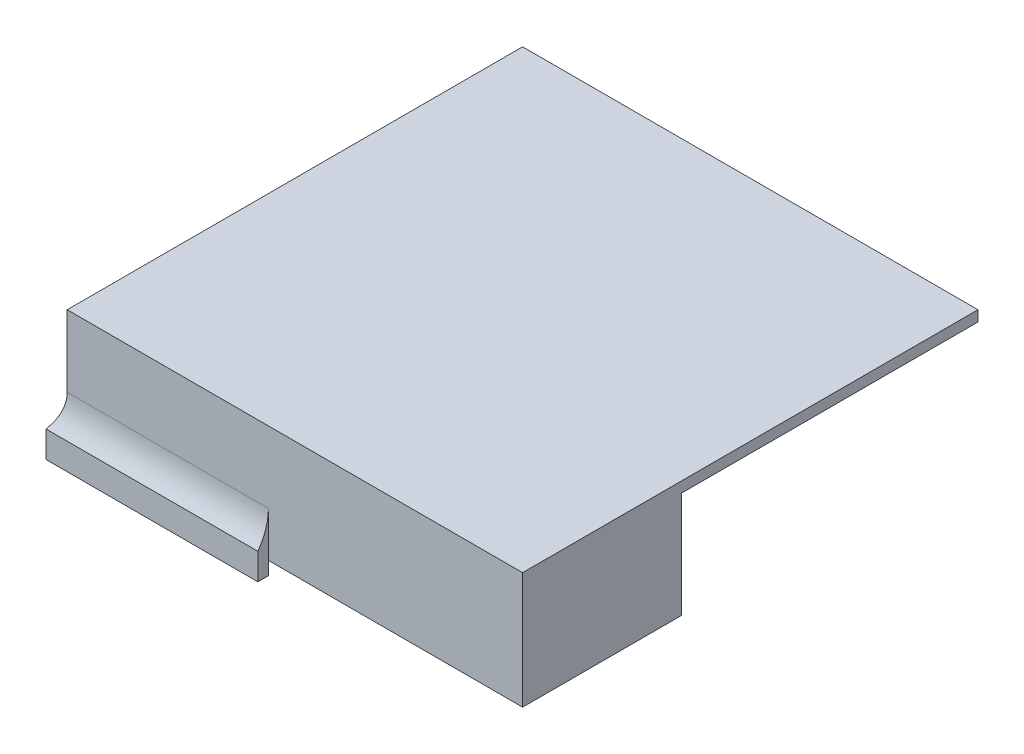
ISO-10303-21;
HEADER;
FILE_DESCRIPTION(('STEP AP214'),'2;1');
FILE_NAME('part.step','',(''),(''),'','','');
FILE_SCHEMA(('AUTOMOTIVE_DESIGN { 1 0 10303 214 1 1 1 1 }'));
ENDSEC;
DATA;
#1=APPLICATION_CONTEXT('core data for automotive mechanical design processes');
#2=APPLICATION_PROTOCOL_DEFINITION('international standard','automotive_design',2000,#1);
#3=PRODUCT_CONTEXT('',#1,'mechanical');
#4=PRODUCT('Part','Part','',(#3));
#5=PRODUCT_RELATED_PRODUCT_CATEGORY('part','',(#4));
#6=PRODUCT_DEFINITION_FORMATION('','',#4);
#7=PRODUCT_DEFINITION_CONTEXT('part definition',#1,'design');
#8=PRODUCT_DEFINITION('design','',#6,#7);
#9=PRODUCT_DEFINITION_SHAPE('','',#8);
#10=(LENGTH_UNIT() NAMED_UNIT(*) SI_UNIT(.MILLI.,.METRE.));
#11=(NAMED_UNIT(*) PLANE_ANGLE_UNIT() SI_UNIT($,.RADIAN.));
#12=(NAMED_UNIT(*) SI_UNIT($,.STERADIAN.) SOLID_ANGLE_UNIT());
#13=UNCERTAINTY_MEASURE_WITH_UNIT(LENGTH_MEASURE(1.E-05),#10,'distance_accuracy_value','');
#14=(GEOMETRIC_REPRESENTATION_CONTEXT(3) GLOBAL_UNCERTAINTY_ASSIGNED_CONTEXT((#13)) GLOBAL_UNIT_ASSIGNED_CONTEXT((#10,
#11,#12)) REPRESENTATION_CONTEXT('',''));
#15=CARTESIAN_POINT('',(0.,0.,0.));
#16=DIRECTION('',(0.,0.,1.));
#17=DIRECTION('',(1.,0.,0.));
#18=AXIS2_PLACEMENT_3D('',#15,#16,#17);
#19=CARTESIAN_POINT('',(0.,20.,43.));
#20=DIRECTION('',(0.,0.,1.));
#21=DIRECTION('',(1.,0.,0.));
#22=AXIS2_PLACEMENT_3D('',#19,#20,#21);
#23=PLANE('',#22);
#24=DIRECTION('',(0.,-1.,0.));
#25=VECTOR('',#24,1.);
#26=CARTESIAN_POINT('',(-43.,20.,43.));
#27=LINE('',#26,#25);
#28=CARTESIAN_POINT('',(-43.,22.,43.));
#29=VERTEX_POINT('',#28);
#30=CARTESIAN_POINT('',(-43.,8.50000000000001,43.));
#31=VERTEX_POINT('',#30);
#32=EDGE_CURVE('E317',#29,#31,#27,.T.);
#33=ORIENTED_EDGE('',*,*,#32,.T.);
#34=DIRECTION('',(1.,0.,0.));
#35=VECTOR('',#34,1.);
#36=CARTESIAN_POINT('',(-4.99999999999999,8.50000000000001,43.));
#37=LINE('',#36,#35);
#38=CARTESIAN_POINT('',(-4.99999999999998,8.50000000000001,43.));
#39=VERTEX_POINT('',#38);
#40=EDGE_CURVE('E329',#31,#39,#37,.T.);
#41=ORIENTED_EDGE('',*,*,#40,.T.);
#42=DIRECTION('',(0.,1.,0.));
#43=VECTOR('',#42,1.);
#44=CARTESIAN_POINT('',(-4.99999999999998,-2.5,43.));
#45=LINE('',#44,#43);
#46=CARTESIAN_POINT('',(-4.99999999999998,0.,43.));
#47=VERTEX_POINT('',#46);
#48=EDGE_CURVE('E60',#47,#39,#45,.T.);
#49=ORIENTED_EDGE('',*,*,#48,.F.);
#50=DIRECTION('',(-1.,0.,0.));
#51=VECTOR('',#50,1.);
#52=CARTESIAN_POINT('',(0.,0.,43.));
#53=LINE('',#52,#51);
#54=CARTESIAN_POINT('',(43.,0.,43.));
#55=VERTEX_POINT('',#54);
#56=EDGE_CURVE('E309',#55,#47,#53,.T.);
#57=ORIENTED_EDGE('',*,*,#56,.F.);
#58=DIRECTION('',(0.,-1.,0.));
#59=VECTOR('',#58,1.);
#60=CARTESIAN_POINT('',(43.,20.,43.));
#61=LINE('',#60,#59);
#62=CARTESIAN_POINT('',(43.,22.,43.));
#63=VERTEX_POINT('',#62);
#64=EDGE_CURVE('E315',#63,#55,#61,.T.);
#65=ORIENTED_EDGE('',*,*,#64,.F.);
#66=DIRECTION('',(1.,0.,0.));
#67=VECTOR('',#66,1.);
#68=CARTESIAN_POINT('',(43.,22.,43.));
#69=LINE('',#68,#67);
#70=EDGE_CURVE('E278',#29,#63,#69,.T.);
#71=ORIENTED_EDGE('',*,*,#70,.F.);
#72=EDGE_LOOP('',(#33,#41,#49,#57,#65,#71));
#73=FACE_BOUND('',#72,.T.);
#74=ADVANCED_FACE('F45',(#73),#23,.T.);
#75=CARTESIAN_POINT('',(14.9827560572969,20.,-14.9827560572969));
#76=DIRECTION('',(0.707106781186547,0.,-0.707106781186548));
#77=DIRECTION('',(-0.707106781186548,0.,-0.707106781186547));
#78=AXIS2_PLACEMENT_3D('',#75,#76,#77);
#79=PLANE('',#78);
#80=DIRECTION('',(0.707106781186548,0.,0.707106781186547));
#81=VECTOR('',#80,1.);
#82=CARTESIAN_POINT('',(14.9827560572969,0.,-14.9827560572969));
#83=LINE('',#82,#81);
#84=CARTESIAN_POINT('',(-13.0344878854062,0.,-43.));
#85=VERTEX_POINT('',#84);
#86=CARTESIAN_POINT('',(43.,0.,13.0344878854062));
#87=VERTEX_POINT('',#86);
#88=EDGE_CURVE('E293',#85,#87,#83,.T.);
#89=ORIENTED_EDGE('',*,*,#88,.F.);
#90=DIRECTION('',(0.,-1.,0.));
#91=VECTOR('',#90,1.);
#92=CARTESIAN_POINT('',(-13.0344878854062,20.,-43.));
#93=LINE('',#92,#91);
#94=CARTESIAN_POINT('',(-13.0344878854062,20.,-43.));
#95=VERTEX_POINT('',#94);
#96=EDGE_CURVE('E324',#95,#85,#93,.T.);
#97=ORIENTED_EDGE('',*,*,#96,.F.);
#98=DIRECTION('',(0.707106781186548,0.,0.707106781186547));
#99=VECTOR('',#98,1.);
#100=CARTESIAN_POINT('',(14.9827560572969,20.,-14.9827560572969));
#101=LINE('',#100,#99);
#102=CARTESIAN_POINT('',(43.,20.,13.0344878854062));
#103=VERTEX_POINT('',#102);
#104=EDGE_CURVE('E294',#95,#103,#101,.T.);
#105=ORIENTED_EDGE('',*,*,#104,.T.);
#106=DIRECTION('',(0.,-1.,0.));
#107=VECTOR('',#106,1.);
#108=CARTESIAN_POINT('',(43.,20.,13.0344878854062));
#109=LINE('',#108,#107);
#110=EDGE_CURVE('E297',#103,#87,#109,.T.);
#111=ORIENTED_EDGE('',*,*,#110,.T.);
#112=EDGE_LOOP('',(#89,#97,#105,#111));
#113=FACE_BOUND('',#112,.T.);
#114=ADVANCED_FACE('F365',(#113),#79,.T.);
#115=CARTESIAN_POINT('',(0.,20.,-43.));
#116=DIRECTION('',(0.,0.,1.));
#117=DIRECTION('',(1.,0.,0.));
#118=AXIS2_PLACEMENT_3D('',#115,#116,#117);
#119=PLANE('',#118);
#120=DIRECTION('',(-1.,0.,0.));
#121=VECTOR('',#120,1.);
#122=CARTESIAN_POINT('',(0.,0.,-43.));
#123=LINE('',#122,#121);
#124=CARTESIAN_POINT('',(-43.,0.,-43.));
#125=VERTEX_POINT('',#124);
#126=EDGE_CURVE('E302',#85,#125,#123,.T.);
#127=ORIENTED_EDGE('',*,*,#126,.T.);
#128=DIRECTION('',(0.,-1.,0.));
#129=VECTOR('',#128,1.);
#130=CARTESIAN_POINT('',(-43.,20.,-43.));
#131=LINE('',#130,#129);
#132=CARTESIAN_POINT('',(-43.,22.,-43.));
#133=VERTEX_POINT('',#132);
#134=EDGE_CURVE('E321',#133,#125,#131,.T.);
#135=ORIENTED_EDGE('',*,*,#134,.F.);
#136=DIRECTION('',(-1.,0.,0.));
#137=VECTOR('',#136,1.);
#138=CARTESIAN_POINT('',(43.,22.,-43.));
#139=LINE('',#138,#137);
#140=CARTESIAN_POINT('',(43.,22.,-43.));
#141=VERTEX_POINT('',#140);
#142=EDGE_CURVE('E284',#141,#133,#139,.T.);
#143=ORIENTED_EDGE('',*,*,#142,.F.);
#144=DIRECTION('',(0.,-1.,0.));
#145=VECTOR('',#144,1.);
#146=CARTESIAN_POINT('',(43.,22.,-43.));
#147=LINE('',#146,#145);
#148=CARTESIAN_POINT('',(43.,20.,-43.));
#149=VERTEX_POINT('',#148);
#150=EDGE_CURVE('E287',#141,#149,#147,.T.);
#151=ORIENTED_EDGE('',*,*,#150,.T.);
#152=DIRECTION('',(-1.,0.,0.));
#153=VECTOR('',#152,1.);
#154=CARTESIAN_POINT('',(43.,20.,-43.));
#155=LINE('',#154,#153);
#156=EDGE_CURVE('E279',#149,#95,#155,.T.);
#157=ORIENTED_EDGE('',*,*,#156,.T.);
#158=ORIENTED_EDGE('',*,*,#96,.T.);
#159=EDGE_LOOP('',(#127,#135,#143,#151,#157,#158));
#160=FACE_BOUND('',#159,.T.);
#161=ADVANCED_FACE('F370',(#160),#119,.F.);
#162=CARTESIAN_POINT('',(-43.,20.,0.));
#163=DIRECTION('',(1.,0.,0.));
#164=DIRECTION('',(0.,0.,-1.));
#165=AXIS2_PLACEMENT_3D('',#162,#163,#164);
#166=PLANE('',#165);
#167=DIRECTION('',(0.,1.,0.));
#168=VECTOR('',#167,1.);
#169=CARTESIAN_POINT('',(-43.,-2.5,3.));
#170=LINE('',#169,#168);
#171=CARTESIAN_POINT('',(-43.,0.,3.));
#172=VERTEX_POINT('',#171);
#173=CARTESIAN_POINT('',(-43.,8.49999999999998,3.));
#174=VERTEX_POINT('',#173);
#175=EDGE_CURVE('E71',#172,#174,#170,.T.);
#176=ORIENTED_EDGE('',*,*,#175,.T.);
#177=DIRECTION('',(0.,0.,1.));
#178=VECTOR('',#177,1.);
#179=CARTESIAN_POINT('',(-43.,8.49999999999998,0.));
#180=LINE('',#179,#178);
#181=EDGE_CURVE('E326',#174,#31,#180,.T.);
#182=ORIENTED_EDGE('',*,*,#181,.T.);
#183=ORIENTED_EDGE('',*,*,#32,.F.);
#184=DIRECTION('',(0.,0.,1.));
#185=VECTOR('',#184,1.);
#186=CARTESIAN_POINT('',(-43.,22.,-43.));
#187=LINE('',#186,#185);
#188=EDGE_CURVE('E274',#133,#29,#187,.T.);
#189=ORIENTED_EDGE('',*,*,#188,.F.);
#190=ORIENTED_EDGE('',*,*,#134,.T.);
#191=DIRECTION('',(0.,0.,1.));
#192=VECTOR('',#191,1.);
#193=CARTESIAN_POINT('',(-43.,0.,0.));
#194=LINE('',#193,#192);
#195=EDGE_CURVE('E305',#125,#172,#194,.T.);
#196=ORIENTED_EDGE('',*,*,#195,.T.);
#197=EDGE_LOOP('',(#176,#182,#183,#189,#190,#196));
#198=FACE_BOUND('',#197,.T.);
#199=ADVANCED_FACE('F339',(#198),#166,.F.);
#200=CARTESIAN_POINT('',(43.,20.,0.));
#201=DIRECTION('',(1.,0.,0.));
#202=DIRECTION('',(0.,0.,-1.));
#203=AXIS2_PLACEMENT_3D('',#200,#201,#202);
#204=PLANE('',#203);
#205=DIRECTION('',(0.,0.,1.));
#206=VECTOR('',#205,1.);
#207=CARTESIAN_POINT('',(43.,0.,0.));
#208=LINE('',#207,#206);
#209=EDGE_CURVE('E298',#87,#55,#208,.T.);
#210=ORIENTED_EDGE('',*,*,#209,.F.);
#211=ORIENTED_EDGE('',*,*,#110,.F.);
#212=DIRECTION('',(0.,0.,-1.));
#213=VECTOR('',#212,1.);
#214=CARTESIAN_POINT('',(43.,20.,-43.));
#215=LINE('',#214,#213);
#216=EDGE_CURVE('E264',#103,#149,#215,.T.);
#217=ORIENTED_EDGE('',*,*,#216,.T.);
#218=ORIENTED_EDGE('',*,*,#150,.F.);
#219=DIRECTION('',(0.,0.,-1.));
#220=VECTOR('',#219,1.);
#221=CARTESIAN_POINT('',(43.,22.,-43.));
#222=LINE('',#221,#220);
#223=EDGE_CURVE('E282',#63,#141,#222,.T.);
#224=ORIENTED_EDGE('',*,*,#223,.F.);
#225=ORIENTED_EDGE('',*,*,#64,.T.);
#226=EDGE_LOOP('',(#210,#211,#217,#218,#224,#225));
#227=FACE_BOUND('',#226,.T.);
#228=ADVANCED_FACE('F375',(#227),#204,.T.);
#229=CARTESIAN_POINT('',(0.,0.,0.));
#230=DIRECTION('',(0.,1.,0.));
#231=DIRECTION('',(0.,0.,1.));
#232=AXIS2_PLACEMENT_3D('',#229,#230,#231);
#233=PLANE('',#232);
#234=DIRECTION('',(0.707106781186548,0.,0.707106781186547));
#235=VECTOR('',#234,1.);
#236=CARTESIAN_POINT('',(-13.8629150101524,0.,-41.));
#237=LINE('',#236,#235);
#238=CARTESIAN_POINT('',(-13.8629150101524,0.,-41.));
#239=VERTEX_POINT('',#238);
#240=CARTESIAN_POINT('',(41.,0.,13.8629150101524));
#241=VERTEX_POINT('',#240);
#242=EDGE_CURVE('E249',#239,#241,#237,.T.);
#243=ORIENTED_EDGE('',*,*,#242,.F.);
#244=DIRECTION('',(1.,0.,0.));
#245=VECTOR('',#244,1.);
#246=CARTESIAN_POINT('',(-41.,0.,-41.));
#247=LINE('',#246,#245);
#248=CARTESIAN_POINT('',(-41.,0.,-41.));
#249=VERTEX_POINT('',#248);
#250=EDGE_CURVE('E197',#249,#239,#247,.T.);
#251=ORIENTED_EDGE('',*,*,#250,.F.);
#252=DIRECTION('',(0.,0.,-1.));
#253=VECTOR('',#252,1.);
#254=CARTESIAN_POINT('',(-41.,0.,41.));
#255=LINE('',#254,#253);
#256=CARTESIAN_POINT('',(-41.,0.,41.));
#257=VERTEX_POINT('',#256);
#258=EDGE_CURVE('E234',#257,#249,#255,.T.);
#259=ORIENTED_EDGE('',*,*,#258,.F.);
#260=DIRECTION('',(-1.,0.,0.));
#261=VECTOR('',#260,1.);
#262=CARTESIAN_POINT('',(41.,0.,41.));
#263=LINE('',#262,#261);
#264=CARTESIAN_POINT('',(41.,0.,41.));
#265=VERTEX_POINT('',#264);
#266=EDGE_CURVE('E256',#265,#257,#263,.T.);
#267=ORIENTED_EDGE('',*,*,#266,.F.);
#268=DIRECTION('',(0.,0.,1.));
#269=VECTOR('',#268,1.);
#270=CARTESIAN_POINT('',(41.,0.,13.8629150101524));
#271=LINE('',#270,#269);
#272=EDGE_CURVE('E253',#241,#265,#271,.T.);
#273=ORIENTED_EDGE('',*,*,#272,.F.);
#274=EDGE_LOOP('',(#243,#251,#259,#267,#273));
#275=FACE_BOUND('',#274,.T.);
#276=ORIENTED_EDGE('',*,*,#88,.T.);
#277=ORIENTED_EDGE('',*,*,#209,.T.);
#278=ORIENTED_EDGE('',*,*,#56,.T.);
#279=CARTESIAN_POINT('',(-43.,0.,43.));
#280=VERTEX_POINT('',#279);
#281=EDGE_CURVE('E308',#47,#280,#53,.T.);
#282=ORIENTED_EDGE('',*,*,#281,.T.);
#283=EDGE_CURVE('E304',#172,#280,#194,.T.);
#284=ORIENTED_EDGE('',*,*,#283,.F.);
#285=ORIENTED_EDGE('',*,*,#195,.F.);
#286=ORIENTED_EDGE('',*,*,#126,.F.);
#287=EDGE_LOOP('',(#276,#277,#278,#282,#284,#285,#286));
#288=FACE_BOUND('',#287,.T.);
#289=ADVANCED_FACE('F467',(#275,#288),#233,.F.);
#290=CARTESIAN_POINT('',(0.,20.,0.));
#291=DIRECTION('',(0.,-1.,0.));
#292=DIRECTION('',(0.,0.,-1.));
#293=AXIS2_PLACEMENT_3D('',#290,#291,#292);
#294=PLANE('',#293);
#295=ORIENTED_EDGE('',*,*,#104,.F.);
#296=ORIENTED_EDGE('',*,*,#156,.F.);
#297=ORIENTED_EDGE('',*,*,#216,.F.);
#298=EDGE_LOOP('',(#295,#296,#297));
#299=FACE_BOUND('',#298,.T.);
#300=ADVANCED_FACE('F472',(#299),#294,.T.);
#301=CARTESIAN_POINT('',(0.,22.,0.));
#302=DIRECTION('',(0.,-1.,0.));
#303=DIRECTION('',(0.,0.,-1.));
#304=AXIS2_PLACEMENT_3D('',#301,#302,#303);
#305=PLANE('',#304);
#306=ORIENTED_EDGE('',*,*,#188,.T.);
#307=ORIENTED_EDGE('',*,*,#70,.T.);
#308=ORIENTED_EDGE('',*,*,#223,.T.);
#309=ORIENTED_EDGE('',*,*,#142,.T.);
#310=EDGE_LOOP('',(#306,#307,#308,#309));
#311=FACE_BOUND('',#310,.T.);
#312=ADVANCED_FACE('F536',(#311),#305,.F.);
#313=CARTESIAN_POINT('',(-41.,20.,-41.));
#314=DIRECTION('',(0.,0.,-1.));
#315=DIRECTION('',(-1.,0.,0.));
#316=AXIS2_PLACEMENT_3D('',#313,#314,#315);
#317=PLANE('',#316);
#318=ORIENTED_EDGE('',*,*,#250,.T.);
#319=DIRECTION('',(0.,-1.,0.));
#320=VECTOR('',#319,1.);
#321=CARTESIAN_POINT('',(-13.8629150101524,20.,-41.));
#322=LINE('',#321,#320);
#323=CARTESIAN_POINT('',(-13.8629150101524,20.,-41.));
#324=VERTEX_POINT('',#323);
#325=EDGE_CURVE('E247',#324,#239,#322,.T.);
#326=ORIENTED_EDGE('',*,*,#325,.F.);
#327=DIRECTION('',(1.,0.,0.));
#328=VECTOR('',#327,1.);
#329=CARTESIAN_POINT('',(-41.,20.,-41.));
#330=LINE('',#329,#328);
#331=CARTESIAN_POINT('',(-41.,20.,-41.));
#332=VERTEX_POINT('',#331);
#333=EDGE_CURVE('E230',#332,#324,#330,.T.);
#334=ORIENTED_EDGE('',*,*,#333,.F.);
#335=DIRECTION('',(0.,-1.,0.));
#336=VECTOR('',#335,1.);
#337=CARTESIAN_POINT('',(-41.,20.,-41.));
#338=LINE('',#337,#336);
#339=EDGE_CURVE('E262',#332,#249,#338,.T.);
#340=ORIENTED_EDGE('',*,*,#339,.T.);
#341=EDGE_LOOP('',(#318,#326,#334,#340));
#342=FACE_BOUND('',#341,.T.);
#343=ADVANCED_FACE('F526',(#342),#317,.F.);
#344=CARTESIAN_POINT('',(-41.,20.,41.));
#345=DIRECTION('',(-1.,0.,0.));
#346=DIRECTION('',(0.,0.,1.));
#347=AXIS2_PLACEMENT_3D('',#344,#345,#346);
#348=PLANE('',#347);
#349=ORIENTED_EDGE('',*,*,#258,.T.);
#350=ORIENTED_EDGE('',*,*,#339,.F.);
#351=DIRECTION('',(0.,0.,-1.));
#352=VECTOR('',#351,1.);
#353=CARTESIAN_POINT('',(-41.,20.,41.));
#354=LINE('',#353,#352);
#355=CARTESIAN_POINT('',(-41.,20.,41.));
#356=VERTEX_POINT('',#355);
#357=EDGE_CURVE('E243',#356,#332,#354,.T.);
#358=ORIENTED_EDGE('',*,*,#357,.F.);
#359=DIRECTION('',(0.,-1.,0.));
#360=VECTOR('',#359,1.);
#361=CARTESIAN_POINT('',(-41.,20.,41.));
#362=LINE('',#361,#360);
#363=EDGE_CURVE('E265',#356,#257,#362,.T.);
#364=ORIENTED_EDGE('',*,*,#363,.T.);
#365=EDGE_LOOP('',(#349,#350,#358,#364));
#366=FACE_BOUND('',#365,.T.);
#367=ADVANCED_FACE('F516',(#366),#348,.F.);
#368=CARTESIAN_POINT('',(41.,20.,41.));
#369=DIRECTION('',(0.,0.,1.));
#370=DIRECTION('',(1.,0.,0.));
#371=AXIS2_PLACEMENT_3D('',#368,#369,#370);
#372=PLANE('',#371);
#373=ORIENTED_EDGE('',*,*,#266,.T.);
#374=ORIENTED_EDGE('',*,*,#363,.F.);
#375=DIRECTION('',(-1.,0.,0.));
#376=VECTOR('',#375,1.);
#377=CARTESIAN_POINT('',(41.,20.,41.));
#378=LINE('',#377,#376);
#379=CARTESIAN_POINT('',(41.,20.,41.));
#380=VERTEX_POINT('',#379);
#381=EDGE_CURVE('E240',#380,#356,#378,.T.);
#382=ORIENTED_EDGE('',*,*,#381,.F.);
#383=DIRECTION('',(0.,-1.,0.));
#384=VECTOR('',#383,1.);
#385=CARTESIAN_POINT('',(41.,20.,41.));
#386=LINE('',#385,#384);
#387=EDGE_CURVE('E268',#380,#265,#386,.T.);
#388=ORIENTED_EDGE('',*,*,#387,.T.);
#389=EDGE_LOOP('',(#373,#374,#382,#388));
#390=FACE_BOUND('',#389,.T.);
#391=ADVANCED_FACE('F505',(#390),#372,.F.);
#392=CARTESIAN_POINT('',(41.,20.,13.8629150101524));
#393=DIRECTION('',(1.,0.,0.));
#394=DIRECTION('',(0.,0.,-1.));
#395=AXIS2_PLACEMENT_3D('',#392,#393,#394);
#396=PLANE('',#395);
#397=ORIENTED_EDGE('',*,*,#272,.T.);
#398=ORIENTED_EDGE('',*,*,#387,.F.);
#399=DIRECTION('',(0.,0.,1.));
#400=VECTOR('',#399,1.);
#401=CARTESIAN_POINT('',(41.,20.,13.8629150101524));
#402=LINE('',#401,#400);
#403=CARTESIAN_POINT('',(41.,20.,13.8629150101524));
#404=VERTEX_POINT('',#403);
#405=EDGE_CURVE('E237',#404,#380,#402,.T.);
#406=ORIENTED_EDGE('',*,*,#405,.F.);
#407=DIRECTION('',(0.,-1.,0.));
#408=VECTOR('',#407,1.);
#409=CARTESIAN_POINT('',(41.,20.,13.8629150101524));
#410=LINE('',#409,#408);
#411=EDGE_CURVE('E270',#404,#241,#410,.T.);
#412=ORIENTED_EDGE('',*,*,#411,.T.);
#413=EDGE_LOOP('',(#397,#398,#406,#412));
#414=FACE_BOUND('',#413,.T.);
#415=ADVANCED_FACE('F495',(#414),#396,.F.);
#416=CARTESIAN_POINT('',(-13.8629150101524,20.,-41.));
#417=DIRECTION('',(0.707106781186547,0.,-0.707106781186548));
#418=DIRECTION('',(-0.707106781186548,0.,-0.707106781186547));
#419=AXIS2_PLACEMENT_3D('',#416,#417,#418);
#420=PLANE('',#419);
#421=ORIENTED_EDGE('',*,*,#242,.T.);
#422=ORIENTED_EDGE('',*,*,#411,.F.);
#423=DIRECTION('',(0.707106781186548,0.,0.707106781186547));
#424=VECTOR('',#423,1.);
#425=CARTESIAN_POINT('',(-13.8629150101524,20.,-41.));
#426=LINE('',#425,#424);
#427=EDGE_CURVE('E233',#324,#404,#426,.T.);
#428=ORIENTED_EDGE('',*,*,#427,.F.);
#429=ORIENTED_EDGE('',*,*,#325,.T.);
#430=EDGE_LOOP('',(#421,#422,#428,#429));
#431=FACE_BOUND('',#430,.T.);
#432=ADVANCED_FACE('F484',(#431),#420,.F.);
#433=CARTESIAN_POINT('',(0.,20.,0.));
#434=DIRECTION('',(0.,-1.,0.));
#435=DIRECTION('',(0.,0.,-1.));
#436=AXIS2_PLACEMENT_3D('',#433,#434,#435);
#437=PLANE('',#436);
#438=ORIENTED_EDGE('',*,*,#333,.T.);
#439=ORIENTED_EDGE('',*,*,#427,.T.);
#440=ORIENTED_EDGE('',*,*,#405,.T.);
#441=ORIENTED_EDGE('',*,*,#381,.T.);
#442=ORIENTED_EDGE('',*,*,#357,.T.);
#443=EDGE_LOOP('',(#438,#439,#440,#441,#442));
#444=FACE_BOUND('',#443,.T.);
#445=ADVANCED_FACE('F459',(#444),#437,.T.);
#446=CARTESIAN_POINT('',(-43.,-2.5,0.));
#447=DIRECTION('',(1.,0.,0.));
#448=DIRECTION('',(0.,0.,-1.));
#449=AXIS2_PLACEMENT_3D('',#446,#447,#448);
#450=PLANE('',#449);
#451=ORIENTED_EDGE('',*,*,#283,.T.);
#452=DIRECTION('',(0.,1.,0.));
#453=VECTOR('',#452,1.);
#454=CARTESIAN_POINT('',(-43.,-2.5,43.));
#455=LINE('',#454,#453);
#456=CARTESIAN_POINT('',(-43.,-2.5,43.));
#457=VERTEX_POINT('',#456);
#458=EDGE_CURVE('E207',#457,#280,#455,.T.);
#459=ORIENTED_EDGE('',*,*,#458,.F.);
#460=DIRECTION('',(0.,0.,-1.));
#461=VECTOR('',#460,1.);
#462=CARTESIAN_POINT('',(-43.,-2.5,0.));
#463=LINE('',#462,#461);
#464=CARTESIAN_POINT('',(-43.,-2.5,3.));
#465=VERTEX_POINT('',#464);
#466=EDGE_CURVE('E203',#457,#465,#463,.T.);
#467=ORIENTED_EDGE('',*,*,#466,.T.);
#468=EDGE_CURVE('E198',#465,#172,#170,.T.);
#469=ORIENTED_EDGE('',*,*,#468,.T.);
#470=EDGE_LOOP('',(#451,#459,#467,#469));
#471=FACE_BOUND('',#470,.T.);
#472=ADVANCED_FACE('F448',(#471),#450,.T.);
#473=CARTESIAN_POINT('',(-45.,-2.5,43.));
#474=DIRECTION('',(0.,0.,1.));
#475=DIRECTION('',(1.,0.,0.));
#476=AXIS2_PLACEMENT_3D('',#473,#474,#475);
#477=PLANE('',#476);
#478=ORIENTED_EDGE('',*,*,#458,.T.);
#479=ORIENTED_EDGE('',*,*,#281,.F.);
#480=CARTESIAN_POINT('',(-4.99999999999998,-2.5,43.));
#481=VERTEX_POINT('',#480);
#482=EDGE_CURVE('E212',#481,#47,#45,.T.);
#483=ORIENTED_EDGE('',*,*,#482,.F.);
#484=DIRECTION('',(1.,0.,0.));
#485=VECTOR('',#484,1.);
#486=CARTESIAN_POINT('',(-45.,-2.5,43.));
#487=LINE('',#486,#485);
#488=EDGE_CURVE('E219',#457,#481,#487,.T.);
#489=ORIENTED_EDGE('',*,*,#488,.F.);
#490=EDGE_LOOP('',(#478,#479,#483,#489));
#491=FACE_BOUND('',#490,.T.);
#492=ADVANCED_FACE('F359',(#491),#477,.F.);
#493=CARTESIAN_POINT('',(-45.,-2.5,0.));
#494=DIRECTION('',(1.,0.,0.));
#495=DIRECTION('',(0.,0.,-1.));
#496=AXIS2_PLACEMENT_3D('',#493,#494,#495);
#497=PLANE('',#496);
#498=DIRECTION('',(0.,0.,-1.));
#499=VECTOR('',#498,1.);
#500=CARTESIAN_POINT('',(-45.,2.5,0.));
#501=LINE('',#500,#499);
#502=CARTESIAN_POINT('',(-45.,2.5,45.));
#503=VERTEX_POINT('',#502);
#504=CARTESIAN_POINT('',(-45.,2.5,3.));
#505=VERTEX_POINT('',#504);
#506=EDGE_CURVE('E188',#503,#505,#501,.T.);
#507=ORIENTED_EDGE('',*,*,#506,.T.);
#508=DIRECTION('',(0.,1.,0.));
#509=VECTOR('',#508,1.);
#510=CARTESIAN_POINT('',(-45.,-2.5,3.));
#511=LINE('',#510,#509);
#512=CARTESIAN_POINT('',(-45.,-2.5,3.));
#513=VERTEX_POINT('',#512);
#514=EDGE_CURVE('E192',#513,#505,#511,.T.);
#515=ORIENTED_EDGE('',*,*,#514,.F.);
#516=DIRECTION('',(0.,0.,-1.));
#517=VECTOR('',#516,1.);
#518=CARTESIAN_POINT('',(-45.,-2.5,0.));
#519=LINE('',#518,#517);
#520=CARTESIAN_POINT('',(-45.,-2.5,45.));
#521=VERTEX_POINT('',#520);
#522=EDGE_CURVE('E176',#521,#513,#519,.T.);
#523=ORIENTED_EDGE('',*,*,#522,.F.);
#524=DIRECTION('',(0.,1.,0.));
#525=VECTOR('',#524,1.);
#526=CARTESIAN_POINT('',(-45.,-2.5,45.));
#527=LINE('',#526,#525);
#528=EDGE_CURVE('E221',#521,#503,#527,.T.);
#529=ORIENTED_EDGE('',*,*,#528,.T.);
#530=EDGE_LOOP('',(#507,#515,#523,#529));
#531=FACE_BOUND('',#530,.T.);
#532=ADVANCED_FACE('F193',(#531),#497,.F.);
#533=CARTESIAN_POINT('',(0.,-2.5,3.));
#534=DIRECTION('',(0.,0.,-1.));
#535=DIRECTION('',(-1.,0.,0.));
#536=AXIS2_PLACEMENT_3D('',#533,#534,#535);
#537=PLANE('',#536);
#538=ORIENTED_EDGE('',*,*,#514,.T.);
#539=CARTESIAN_POINT('',(-53.,8.49999999999998,3.));
#540=DIRECTION('',(0.,0.,-1.));
#541=DIRECTION('',(-1.,0.,0.));
#542=AXIS2_PLACEMENT_3D('',#539,#540,#541);
#543=CIRCLE('',#542,10.);
#544=EDGE_CURVE('E54',#505,#174,#543,.F.);
#545=ORIENTED_EDGE('',*,*,#544,.T.);
#546=ORIENTED_EDGE('',*,*,#175,.F.);
#547=ORIENTED_EDGE('',*,*,#468,.F.);
#548=DIRECTION('',(-1.,0.,0.));
#549=VECTOR('',#548,1.);
#550=CARTESIAN_POINT('',(0.,-2.5,3.));
#551=LINE('',#550,#549);
#552=EDGE_CURVE('E181',#465,#513,#551,.T.);
#553=ORIENTED_EDGE('',*,*,#552,.T.);
#554=EDGE_LOOP('',(#538,#545,#546,#547,#553));
#555=FACE_BOUND('',#554,.T.);
#556=ADVANCED_FACE('F200',(#555),#537,.T.);
#557=CARTESIAN_POINT('',(0.,-2.5,0.));
#558=DIRECTION('',(0.,-1.,0.));
#559=DIRECTION('',(0.,0.,-1.));
#560=AXIS2_PLACEMENT_3D('',#557,#558,#559);
#561=PLANE('',#560);
#562=ORIENTED_EDGE('',*,*,#466,.F.);
#563=ORIENTED_EDGE('',*,*,#488,.T.);
#564=DIRECTION('',(0.,0.,1.));
#565=VECTOR('',#564,1.);
#566=CARTESIAN_POINT('',(-4.99999999999998,-2.5,43.));
#567=LINE('',#566,#565);
#568=CARTESIAN_POINT('',(-4.99999999999998,-2.5,45.));
#569=VERTEX_POINT('',#568);
#570=EDGE_CURVE('E216',#481,#569,#567,.T.);
#571=ORIENTED_EDGE('',*,*,#570,.T.);
#572=DIRECTION('',(1.,0.,0.));
#573=VECTOR('',#572,1.);
#574=CARTESIAN_POINT('',(-45.,-2.5,45.));
#575=LINE('',#574,#573);
#576=EDGE_CURVE('E184',#521,#569,#575,.T.);
#577=ORIENTED_EDGE('',*,*,#576,.F.);
#578=ORIENTED_EDGE('',*,*,#522,.T.);
#579=ORIENTED_EDGE('',*,*,#552,.F.);
#580=EDGE_LOOP('',(#562,#563,#571,#577,#578,#579));
#581=FACE_BOUND('',#580,.T.);
#582=ADVANCED_FACE('F179',(#581),#561,.T.);
#583=CARTESIAN_POINT('',(-45.,-2.5,45.));
#584=DIRECTION('',(0.,0.,1.));
#585=DIRECTION('',(1.,0.,0.));
#586=AXIS2_PLACEMENT_3D('',#583,#584,#585);
#587=PLANE('',#586);
#588=DIRECTION('',(1.,0.,0.));
#589=VECTOR('',#588,1.);
#590=CARTESIAN_POINT('',(-45.,2.5,45.));
#591=LINE('',#590,#589);
#592=CARTESIAN_POINT('',(-4.99999999999998,2.5,45.));
#593=VERTEX_POINT('',#592);
#594=EDGE_CURVE('E217',#503,#593,#591,.T.);
#595=ORIENTED_EDGE('',*,*,#594,.F.);
#596=ORIENTED_EDGE('',*,*,#528,.F.);
#597=ORIENTED_EDGE('',*,*,#576,.T.);
#598=DIRECTION('',(0.,1.,0.));
#599=VECTOR('',#598,1.);
#600=CARTESIAN_POINT('',(-4.99999999999998,-2.5,45.));
#601=LINE('',#600,#599);
#602=EDGE_CURVE('E226',#569,#593,#601,.T.);
#603=ORIENTED_EDGE('',*,*,#602,.T.);
#604=EDGE_LOOP('',(#595,#596,#597,#603));
#605=FACE_BOUND('',#604,.T.);
#606=ADVANCED_FACE('F351',(#605),#587,.T.);
#607=CARTESIAN_POINT('',(-4.99999999999998,-2.5,43.));
#608=DIRECTION('',(-1.,0.,0.));
#609=DIRECTION('',(0.,0.,1.));
#610=AXIS2_PLACEMENT_3D('',#607,#608,#609);
#611=PLANE('',#610);
#612=ORIENTED_EDGE('',*,*,#48,.T.);
#613=CARTESIAN_POINT('',(-4.99999999999998,8.50000000000001,53.));
#614=DIRECTION('',(-1.,0.,0.));
#615=DIRECTION('',(0.,0.,1.));
#616=AXIS2_PLACEMENT_3D('',#613,#614,#615);
#617=CIRCLE('',#616,10.);
#618=EDGE_CURVE('E11',#39,#593,#617,.T.);
#619=ORIENTED_EDGE('',*,*,#618,.T.);
#620=ORIENTED_EDGE('',*,*,#602,.F.);
#621=ORIENTED_EDGE('',*,*,#570,.F.);
#622=ORIENTED_EDGE('',*,*,#482,.T.);
#623=EDGE_LOOP('',(#612,#619,#620,#621,#622));
#624=FACE_BOUND('',#623,.T.);
#625=ADVANCED_FACE('F348',(#624),#611,.F.);
#626=CARTESIAN_POINT('',(0.,8.50000000000001,53.));
#627=DIRECTION('',(-1.,0.,0.));
#628=DIRECTION('',(0.,0.,1.));
#629=AXIS2_PLACEMENT_3D('',#626,#627,#628);
#630=CYLINDRICAL_SURFACE('',#629,10.);
#631=ORIENTED_EDGE('',*,*,#618,.F.);
#632=ORIENTED_EDGE('',*,*,#40,.F.);
#633=CARTESIAN_POINT('',(-53.,8.5,53.));
#634=DIRECTION('',(0.707106781186547,0.,0.707106781186548));
#635=DIRECTION('',(-0.707106781186548,0.,0.707106781186547));
#636=AXIS2_PLACEMENT_3D('',#633,#634,#635);
#637=ELLIPSE('',#636,14.142135623731,10.);
#638=EDGE_CURVE('E49',#503,#31,#637,.T.);
#639=ORIENTED_EDGE('',*,*,#638,.F.);
#640=ORIENTED_EDGE('',*,*,#594,.T.);
#641=EDGE_LOOP('',(#631,#632,#639,#640));
#642=FACE_BOUND('',#641,.T.);
#643=ADVANCED_FACE('F47',(#642),#630,.F.);
#644=CARTESIAN_POINT('',(-53.,8.49999999999998,0.));
#645=DIRECTION('',(0.,0.,1.));
#646=DIRECTION('',(1.,0.,0.));
#647=AXIS2_PLACEMENT_3D('',#644,#645,#646);
#648=CYLINDRICAL_SURFACE('',#647,10.);
#649=ORIENTED_EDGE('',*,*,#638,.T.);
#650=ORIENTED_EDGE('',*,*,#181,.F.);
#651=ORIENTED_EDGE('',*,*,#544,.F.);
#652=ORIENTED_EDGE('',*,*,#506,.F.);
#653=EDGE_LOOP('',(#649,#650,#651,#652));
#654=FACE_BOUND('',#653,.T.);
#655=ADVANCED_FACE('F337',(#654),#648,.F.);
#656=CLOSED_SHELL('',(#74,#114,#161,#199,#228,#289,#300,#312,#343,#367,#391,#415,#432,#445,#472,
#492,#532,#556,#582,#606,#625,#643,#655));
#657=MANIFOLD_SOLID_BREP('B2',#656);
#658=ADVANCED_BREP_SHAPE_REPRESENTATION('',(#18,#657),#14);
#659=SHAPE_DEFINITION_REPRESENTATION(#9,#658);
ENDSEC;
END-ISO-10303-21;
